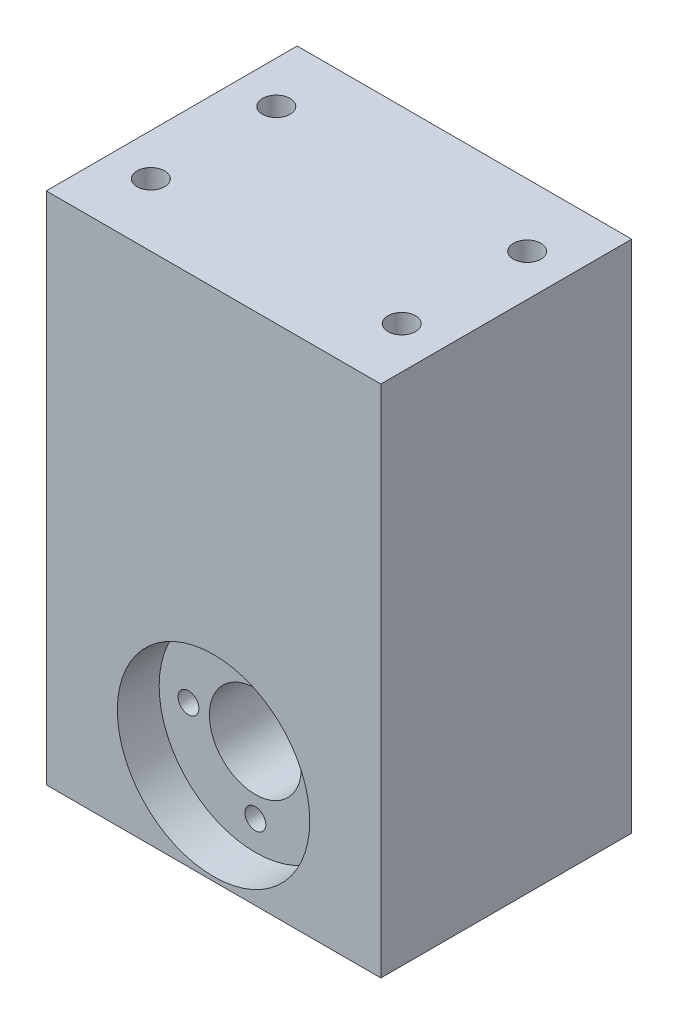
ISO-10303-21;
HEADER;
FILE_DESCRIPTION(('STEP AP214'),'2;1');
FILE_NAME('part.step','',(''),(''),'','','');
FILE_SCHEMA(('AUTOMOTIVE_DESIGN { 1 0 10303 214 1 1 1 1 }'));
ENDSEC;
DATA;
#1=APPLICATION_CONTEXT('core data for automotive mechanical design processes');
#2=APPLICATION_PROTOCOL_DEFINITION('international standard','automotive_design',2000,#1);
#3=PRODUCT_CONTEXT('',#1,'mechanical');
#4=PRODUCT('Part','Part','',(#3));
#5=PRODUCT_RELATED_PRODUCT_CATEGORY('part','',(#4));
#6=PRODUCT_DEFINITION_FORMATION('','',#4);
#7=PRODUCT_DEFINITION_CONTEXT('part definition',#1,'design');
#8=PRODUCT_DEFINITION('design','',#6,#7);
#9=PRODUCT_DEFINITION_SHAPE('','',#8);
#10=(LENGTH_UNIT() NAMED_UNIT(*) SI_UNIT(.MILLI.,.METRE.));
#11=(NAMED_UNIT(*) PLANE_ANGLE_UNIT() SI_UNIT($,.RADIAN.));
#12=(NAMED_UNIT(*) SI_UNIT($,.STERADIAN.) SOLID_ANGLE_UNIT());
#13=UNCERTAINTY_MEASURE_WITH_UNIT(LENGTH_MEASURE(1.E-05),#10,'distance_accuracy_value','');
#14=(GEOMETRIC_REPRESENTATION_CONTEXT(3) GLOBAL_UNCERTAINTY_ASSIGNED_CONTEXT((#13)) GLOBAL_UNIT_ASSIGNED_CONTEXT((#10,
#11,#12)) REPRESENTATION_CONTEXT('',''));
#15=CARTESIAN_POINT('',(0.,0.,0.));
#16=DIRECTION('',(0.,0.,1.));
#17=DIRECTION('',(1.,0.,0.));
#18=AXIS2_PLACEMENT_3D('',#15,#16,#17);
#19=CARTESIAN_POINT('',(20.,62.5,15.));
#20=DIRECTION('',(0.,-1.,0.));
#21=DIRECTION('',(0.,0.,-1.));
#22=AXIS2_PLACEMENT_3D('',#19,#20,#21);
#23=PLANE('',#22);
#24=CARTESIAN_POINT('',(-15.,62.5,-7.5));
#25=DIRECTION('',(0.,1.,0.));
#26=DIRECTION('',(0.,0.,1.));
#27=AXIS2_PLACEMENT_3D('',#24,#25,#26);
#28=CIRCLE('',#27,1.64999999999999);
#29=CARTESIAN_POINT('',(-15.,62.5,-5.85000000000001));
#30=VERTEX_POINT('',#29);
#31=EDGE_CURVE('E139',#30,#30,#28,.T.);
#32=ORIENTED_EDGE('',*,*,#31,.F.);
#33=EDGE_LOOP('',(#32));
#34=FACE_BOUND('',#33,.T.);
#35=CARTESIAN_POINT('',(15.,62.5,-7.5));
#36=DIRECTION('',(0.,1.,0.));
#37=DIRECTION('',(0.,0.,1.));
#38=AXIS2_PLACEMENT_3D('',#35,#36,#37);
#39=CIRCLE('',#38,1.64999999999999);
#40=CARTESIAN_POINT('',(15.,62.5,-5.85000000000001));
#41=VERTEX_POINT('',#40);
#42=EDGE_CURVE('E133',#41,#41,#39,.T.);
#43=ORIENTED_EDGE('',*,*,#42,.F.);
#44=EDGE_LOOP('',(#43));
#45=FACE_BOUND('',#44,.T.);
#46=CARTESIAN_POINT('',(15.,62.5,7.5));
#47=DIRECTION('',(0.,1.,0.));
#48=DIRECTION('',(0.,0.,1.));
#49=AXIS2_PLACEMENT_3D('',#46,#47,#48);
#50=CIRCLE('',#49,1.64999999999999);
#51=CARTESIAN_POINT('',(15.,62.5,9.14999999999998));
#52=VERTEX_POINT('',#51);
#53=EDGE_CURVE('E127',#52,#52,#50,.T.);
#54=ORIENTED_EDGE('',*,*,#53,.F.);
#55=EDGE_LOOP('',(#54));
#56=FACE_BOUND('',#55,.T.);
#57=CARTESIAN_POINT('',(-15.,62.5,7.50000000000001));
#58=DIRECTION('',(0.,1.,0.));
#59=DIRECTION('',(0.,0.,1.));
#60=AXIS2_PLACEMENT_3D('',#57,#58,#59);
#61=CIRCLE('',#60,1.64999999999999);
#62=CARTESIAN_POINT('',(-15.,62.5,9.15));
#63=VERTEX_POINT('',#62);
#64=EDGE_CURVE('E121',#63,#63,#61,.T.);
#65=ORIENTED_EDGE('',*,*,#64,.F.);
#66=EDGE_LOOP('',(#65));
#67=FACE_BOUND('',#66,.T.);
#68=DIRECTION('',(-1.,0.,0.));
#69=VECTOR('',#68,1.);
#70=CARTESIAN_POINT('',(20.,62.5,-15.));
#71=LINE('',#70,#69);
#72=CARTESIAN_POINT('',(20.,62.5,-15.));
#73=VERTEX_POINT('',#72);
#74=CARTESIAN_POINT('',(-20.,62.5,-15.));
#75=VERTEX_POINT('',#74);
#76=EDGE_CURVE('E95',#73,#75,#71,.T.);
#77=ORIENTED_EDGE('',*,*,#76,.T.);
#78=DIRECTION('',(0.,0.,-1.));
#79=VECTOR('',#78,1.);
#80=CARTESIAN_POINT('',(-20.,62.5,15.));
#81=LINE('',#80,#79);
#82=CARTESIAN_POINT('',(-20.,62.5,15.));
#83=VERTEX_POINT('',#82);
#84=EDGE_CURVE('E11',#83,#75,#81,.T.);
#85=ORIENTED_EDGE('',*,*,#84,.F.);
#86=DIRECTION('',(-1.,0.,0.));
#87=VECTOR('',#86,1.);
#88=CARTESIAN_POINT('',(20.,62.5,15.));
#89=LINE('',#88,#87);
#90=CARTESIAN_POINT('',(20.,62.5,15.));
#91=VERTEX_POINT('',#90);
#92=EDGE_CURVE('E89',#91,#83,#89,.T.);
#93=ORIENTED_EDGE('',*,*,#92,.F.);
#94=DIRECTION('',(0.,0.,-1.));
#95=VECTOR('',#94,1.);
#96=CARTESIAN_POINT('',(20.,62.5,15.));
#97=LINE('',#96,#95);
#98=EDGE_CURVE('E50',#91,#73,#97,.T.);
#99=ORIENTED_EDGE('',*,*,#98,.T.);
#100=EDGE_LOOP('',(#77,#85,#93,#99));
#101=FACE_BOUND('',#100,.T.);
#102=ADVANCED_FACE('F43',(#34,#45,#56,#67,#101),#23,.F.);
#103=CARTESIAN_POINT('',(-20.,62.5,15.));
#104=DIRECTION('',(1.,0.,0.));
#105=DIRECTION('',(0.,1.,0.));
#106=AXIS2_PLACEMENT_3D('',#103,#104,#105);
#107=PLANE('',#106);
#108=DIRECTION('',(0.,-1.,0.));
#109=VECTOR('',#108,1.);
#110=CARTESIAN_POINT('',(-20.,62.5,-15.));
#111=LINE('',#110,#109);
#112=CARTESIAN_POINT('',(-20.,1.,-15.));
#113=VERTEX_POINT('',#112);
#114=EDGE_CURVE('E90',#75,#113,#111,.T.);
#115=ORIENTED_EDGE('',*,*,#114,.T.);
#116=DIRECTION('',(0.,0.,1.));
#117=VECTOR('',#116,1.);
#118=CARTESIAN_POINT('',(-20.,1.,-15.));
#119=LINE('',#118,#117);
#120=CARTESIAN_POINT('',(-20.,1.,15.));
#121=VERTEX_POINT('',#120);
#122=EDGE_CURVE('E57',#113,#121,#119,.T.);
#123=ORIENTED_EDGE('',*,*,#122,.T.);
#124=DIRECTION('',(0.,-1.,0.));
#125=VECTOR('',#124,1.);
#126=CARTESIAN_POINT('',(-20.,62.5,15.));
#127=LINE('',#126,#125);
#128=EDGE_CURVE('E106',#83,#121,#127,.T.);
#129=ORIENTED_EDGE('',*,*,#128,.F.);
#130=ORIENTED_EDGE('',*,*,#84,.T.);
#131=EDGE_LOOP('',(#115,#123,#129,#130));
#132=FACE_BOUND('',#131,.T.);
#133=ADVANCED_FACE('F172',(#132),#107,.F.);
#134=CARTESIAN_POINT('',(20.,62.5,15.));
#135=DIRECTION('',(-1.,0.,0.));
#136=DIRECTION('',(0.,-1.,0.));
#137=AXIS2_PLACEMENT_3D('',#134,#135,#136);
#138=PLANE('',#137);
#139=DIRECTION('',(0.,1.,0.));
#140=VECTOR('',#139,1.);
#141=CARTESIAN_POINT('',(20.,62.5,15.));
#142=LINE('',#141,#140);
#143=CARTESIAN_POINT('',(20.,1.,15.));
#144=VERTEX_POINT('',#143);
#145=EDGE_CURVE('E66',#144,#91,#142,.T.);
#146=ORIENTED_EDGE('',*,*,#145,.F.);
#147=DIRECTION('',(0.,0.,1.));
#148=VECTOR('',#147,1.);
#149=CARTESIAN_POINT('',(20.,1.,-15.));
#150=LINE('',#149,#148);
#151=CARTESIAN_POINT('',(20.,1.,-15.));
#152=VERTEX_POINT('',#151);
#153=EDGE_CURVE('E86',#152,#144,#150,.T.);
#154=ORIENTED_EDGE('',*,*,#153,.F.);
#155=DIRECTION('',(0.,1.,0.));
#156=VECTOR('',#155,1.);
#157=CARTESIAN_POINT('',(20.,62.5,-15.));
#158=LINE('',#157,#156);
#159=EDGE_CURVE('E80',#152,#73,#158,.T.);
#160=ORIENTED_EDGE('',*,*,#159,.T.);
#161=ORIENTED_EDGE('',*,*,#98,.F.);
#162=EDGE_LOOP('',(#146,#154,#160,#161));
#163=FACE_BOUND('',#162,.T.);
#164=ADVANCED_FACE('F82',(#163),#138,.F.);
#165=CARTESIAN_POINT('',(0.,0.,15.));
#166=DIRECTION('',(0.,0.,1.));
#167=DIRECTION('',(1.,0.,0.));
#168=AXIS2_PLACEMENT_3D('',#165,#166,#167);
#169=PLANE('',#168);
#170=DIRECTION('',(-1.,0.,0.));
#171=VECTOR('',#170,1.);
#172=CARTESIAN_POINT('',(-20.,1.,15.));
#173=LINE('',#172,#171);
#174=EDGE_CURVE('E169',#144,#121,#173,.T.);
#175=ORIENTED_EDGE('',*,*,#174,.F.);
#176=ORIENTED_EDGE('',*,*,#145,.T.);
#177=ORIENTED_EDGE('',*,*,#92,.T.);
#178=ORIENTED_EDGE('',*,*,#128,.T.);
#179=EDGE_LOOP('',(#175,#176,#177,#178));
#180=FACE_BOUND('',#179,.T.);
#181=CARTESIAN_POINT('',(0.,13.,15.));
#182=DIRECTION('',(0.,0.,1.));
#183=DIRECTION('',(1.,0.,0.));
#184=AXIS2_PLACEMENT_3D('',#181,#182,#183);
#185=CIRCLE('',#184,11.5);
#186=CARTESIAN_POINT('',(11.5,13.,15.));
#187=VERTEX_POINT('',#186);
#188=EDGE_CURVE('E102',#187,#187,#185,.T.);
#189=ORIENTED_EDGE('',*,*,#188,.F.);
#190=EDGE_LOOP('',(#189));
#191=FACE_BOUND('',#190,.T.);
#192=ADVANCED_FACE('F174',(#180,#191),#169,.T.);
#193=CARTESIAN_POINT('',(0.,0.,-15.));
#194=DIRECTION('',(0.,0.,1.));
#195=DIRECTION('',(1.,0.,0.));
#196=AXIS2_PLACEMENT_3D('',#193,#194,#195);
#197=PLANE('',#196);
#198=CARTESIAN_POINT('',(0.,21.,-15.));
#199=DIRECTION('',(0.,0.,1.));
#200=DIRECTION('',(1.,0.,0.));
#201=AXIS2_PLACEMENT_3D('',#198,#199,#200);
#202=CIRCLE('',#201,1.25);
#203=CARTESIAN_POINT('',(1.24999999999999,21.,-15.));
#204=VERTEX_POINT('',#203);
#205=EDGE_CURVE('E160',#204,#204,#202,.T.);
#206=ORIENTED_EDGE('',*,*,#205,.T.);
#207=EDGE_LOOP('',(#206));
#208=FACE_BOUND('',#207,.T.);
#209=CARTESIAN_POINT('',(0.,5.,-15.));
#210=DIRECTION('',(0.,0.,1.));
#211=DIRECTION('',(1.,0.,0.));
#212=AXIS2_PLACEMENT_3D('',#209,#210,#211);
#213=CIRCLE('',#212,1.25);
#214=CARTESIAN_POINT('',(1.25,5.,-15.));
#215=VERTEX_POINT('',#214);
#216=EDGE_CURVE('E154',#215,#215,#213,.T.);
#217=ORIENTED_EDGE('',*,*,#216,.T.);
#218=EDGE_LOOP('',(#217));
#219=FACE_BOUND('',#218,.T.);
#220=CARTESIAN_POINT('',(-8.,13.,-15.));
#221=DIRECTION('',(0.,0.,1.));
#222=DIRECTION('',(1.,0.,0.));
#223=AXIS2_PLACEMENT_3D('',#220,#221,#222);
#224=CIRCLE('',#223,1.25);
#225=CARTESIAN_POINT('',(-6.75000000000001,13.,-15.));
#226=VERTEX_POINT('',#225);
#227=EDGE_CURVE('E148',#226,#226,#224,.T.);
#228=ORIENTED_EDGE('',*,*,#227,.T.);
#229=EDGE_LOOP('',(#228));
#230=FACE_BOUND('',#229,.T.);
#231=CARTESIAN_POINT('',(8.,13.,-15.));
#232=DIRECTION('',(0.,0.,1.));
#233=DIRECTION('',(1.,0.,0.));
#234=AXIS2_PLACEMENT_3D('',#231,#232,#233);
#235=CIRCLE('',#234,1.24999999999999);
#236=CARTESIAN_POINT('',(9.24999999999999,13.,-15.));
#237=VERTEX_POINT('',#236);
#238=EDGE_CURVE('E142',#237,#237,#235,.T.);
#239=ORIENTED_EDGE('',*,*,#238,.T.);
#240=EDGE_LOOP('',(#239));
#241=FACE_BOUND('',#240,.T.);
#242=CARTESIAN_POINT('',(0.,13.,-15.));
#243=DIRECTION('',(0.,0.,1.));
#244=DIRECTION('',(1.,0.,0.));
#245=AXIS2_PLACEMENT_3D('',#242,#243,#244);
#246=CIRCLE('',#245,5.5);
#247=CARTESIAN_POINT('',(5.5,13.,-15.));
#248=VERTEX_POINT('',#247);
#249=EDGE_CURVE('E111',#248,#248,#246,.T.);
#250=ORIENTED_EDGE('',*,*,#249,.T.);
#251=EDGE_LOOP('',(#250));
#252=FACE_BOUND('',#251,.T.);
#253=ORIENTED_EDGE('',*,*,#159,.F.);
#254=DIRECTION('',(-1.,0.,0.));
#255=VECTOR('',#254,1.);
#256=CARTESIAN_POINT('',(-20.,1.,-15.));
#257=LINE('',#256,#255);
#258=EDGE_CURVE('E167',#152,#113,#257,.T.);
#259=ORIENTED_EDGE('',*,*,#258,.T.);
#260=ORIENTED_EDGE('',*,*,#114,.F.);
#261=ORIENTED_EDGE('',*,*,#76,.F.);
#262=EDGE_LOOP('',(#253,#259,#260,#261));
#263=FACE_BOUND('',#262,.T.);
#264=ADVANCED_FACE('F96',(#208,#219,#230,#241,#252,#263),#197,.F.);
#265=CARTESIAN_POINT('',(0.,13.,10.));
#266=DIRECTION('',(0.,0.,1.));
#267=DIRECTION('',(1.,0.,0.));
#268=AXIS2_PLACEMENT_3D('',#265,#266,#267);
#269=CYLINDRICAL_SURFACE('',#268,11.5);
#270=CARTESIAN_POINT('',(0.,13.,10.));
#271=DIRECTION('',(0.,0.,1.));
#272=DIRECTION('',(1.,0.,0.));
#273=AXIS2_PLACEMENT_3D('',#270,#271,#272);
#274=CIRCLE('',#273,11.5);
#275=CARTESIAN_POINT('',(11.5,13.,10.));
#276=VERTEX_POINT('',#275);
#277=EDGE_CURVE('E98',#276,#276,#274,.T.);
#278=ORIENTED_EDGE('',*,*,#277,.F.);
#279=EDGE_LOOP('',(#278));
#280=FACE_BOUND('',#279,.T.);
#281=ORIENTED_EDGE('',*,*,#188,.T.);
#282=EDGE_LOOP('',(#281));
#283=FACE_BOUND('',#282,.T.);
#284=ADVANCED_FACE('F181',(#280,#283),#269,.F.);
#285=CARTESIAN_POINT('',(0.,13.,10.));
#286=DIRECTION('',(0.,0.,1.));
#287=DIRECTION('',(1.,0.,0.));
#288=AXIS2_PLACEMENT_3D('',#285,#286,#287);
#289=PLANE('',#288);
#290=CARTESIAN_POINT('',(0.,21.,10.));
#291=DIRECTION('',(0.,0.,1.));
#292=DIRECTION('',(1.,0.,0.));
#293=AXIS2_PLACEMENT_3D('',#290,#291,#292);
#294=CIRCLE('',#293,1.25);
#295=CARTESIAN_POINT('',(1.25,21.,10.));
#296=VERTEX_POINT('',#295);
#297=EDGE_CURVE('E163',#296,#296,#294,.T.);
#298=ORIENTED_EDGE('',*,*,#297,.F.);
#299=EDGE_LOOP('',(#298));
#300=FACE_BOUND('',#299,.T.);
#301=CARTESIAN_POINT('',(0.,5.,10.));
#302=DIRECTION('',(0.,0.,1.));
#303=DIRECTION('',(1.,0.,0.));
#304=AXIS2_PLACEMENT_3D('',#301,#302,#303);
#305=CIRCLE('',#304,1.25);
#306=CARTESIAN_POINT('',(1.25,5.,10.));
#307=VERTEX_POINT('',#306);
#308=EDGE_CURVE('E157',#307,#307,#305,.T.);
#309=ORIENTED_EDGE('',*,*,#308,.F.);
#310=EDGE_LOOP('',(#309));
#311=FACE_BOUND('',#310,.T.);
#312=CARTESIAN_POINT('',(-8.,13.,10.));
#313=DIRECTION('',(0.,0.,1.));
#314=DIRECTION('',(1.,0.,0.));
#315=AXIS2_PLACEMENT_3D('',#312,#313,#314);
#316=CIRCLE('',#315,1.25);
#317=CARTESIAN_POINT('',(-6.75,13.,10.));
#318=VERTEX_POINT('',#317);
#319=EDGE_CURVE('E151',#318,#318,#316,.T.);
#320=ORIENTED_EDGE('',*,*,#319,.F.);
#321=EDGE_LOOP('',(#320));
#322=FACE_BOUND('',#321,.T.);
#323=CARTESIAN_POINT('',(8.,13.,10.));
#324=DIRECTION('',(0.,0.,1.));
#325=DIRECTION('',(1.,0.,0.));
#326=AXIS2_PLACEMENT_3D('',#323,#324,#325);
#327=CIRCLE('',#326,1.25);
#328=CARTESIAN_POINT('',(9.25,13.,10.));
#329=VERTEX_POINT('',#328);
#330=EDGE_CURVE('E145',#329,#329,#327,.T.);
#331=ORIENTED_EDGE('',*,*,#330,.F.);
#332=EDGE_LOOP('',(#331));
#333=FACE_BOUND('',#332,.T.);
#334=CARTESIAN_POINT('',(0.,13.,10.));
#335=DIRECTION('',(0.,0.,1.));
#336=DIRECTION('',(1.,0.,0.));
#337=AXIS2_PLACEMENT_3D('',#334,#335,#336);
#338=CIRCLE('',#337,5.5);
#339=CARTESIAN_POINT('',(5.5,13.,10.));
#340=VERTEX_POINT('',#339);
#341=EDGE_CURVE('E113',#340,#340,#338,.T.);
#342=ORIENTED_EDGE('',*,*,#341,.F.);
#343=EDGE_LOOP('',(#342));
#344=FACE_BOUND('',#343,.T.);
#345=ORIENTED_EDGE('',*,*,#277,.T.);
#346=EDGE_LOOP('',(#345));
#347=FACE_BOUND('',#346,.T.);
#348=ADVANCED_FACE('F183',(#300,#311,#322,#333,#344,#347),#289,.T.);
#349=CARTESIAN_POINT('',(0.,13.,-15.));
#350=DIRECTION('',(0.,0.,1.));
#351=DIRECTION('',(1.,0.,0.));
#352=AXIS2_PLACEMENT_3D('',#349,#350,#351);
#353=CYLINDRICAL_SURFACE('',#352,5.5);
#354=CARTESIAN_POINT('',(5.5,13.,-15.));
#355=CARTESIAN_POINT('',(5.5,13.,-14.7395833333333));
#356=CARTESIAN_POINT('',(5.5,13.,-14.4791666666667));
#357=CARTESIAN_POINT('',(5.5,13.,-13.9583333333333));
#358=CARTESIAN_POINT('',(5.5,13.,-13.6979166666667));
#359=CARTESIAN_POINT('',(5.5,13.,-13.1770833333333));
#360=CARTESIAN_POINT('',(5.5,13.,-12.9166666666667));
#361=CARTESIAN_POINT('',(5.5,13.,-12.3958333333333));
#362=CARTESIAN_POINT('',(5.5,13.,-12.1354166666667));
#363=CARTESIAN_POINT('',(5.5,13.,-11.6145833333333));
#364=CARTESIAN_POINT('',(5.5,13.,-11.3541666666667));
#365=CARTESIAN_POINT('',(5.5,13.,-10.8333333333333));
#366=CARTESIAN_POINT('',(5.5,13.,-10.5729166666667));
#367=CARTESIAN_POINT('',(5.5,13.,-10.0520833333333));
#368=CARTESIAN_POINT('',(5.5,13.,-9.79166666666667));
#369=CARTESIAN_POINT('',(5.5,13.,-9.27083333333333));
#370=CARTESIAN_POINT('',(5.5,13.,-9.01041666666667));
#371=CARTESIAN_POINT('',(5.5,13.,-8.48958333333333));
#372=CARTESIAN_POINT('',(5.5,13.,-8.22916666666667));
#373=CARTESIAN_POINT('',(5.5,13.,-7.70833333333333));
#374=CARTESIAN_POINT('',(5.5,13.,-7.44791666666667));
#375=CARTESIAN_POINT('',(5.5,13.,-6.92708333333333));
#376=CARTESIAN_POINT('',(5.5,13.,-6.66666666666667));
#377=CARTESIAN_POINT('',(5.5,13.,-6.14583333333334));
#378=CARTESIAN_POINT('',(5.5,13.,-5.88541666666667));
#379=CARTESIAN_POINT('',(5.5,13.,-5.36458333333333));
#380=CARTESIAN_POINT('',(5.5,13.,-5.10416666666667));
#381=CARTESIAN_POINT('',(5.5,13.,-4.58333333333334));
#382=CARTESIAN_POINT('',(5.5,13.,-4.32291666666667));
#383=CARTESIAN_POINT('',(5.5,13.,-3.80208333333334));
#384=CARTESIAN_POINT('',(5.5,13.,-3.54166666666667));
#385=CARTESIAN_POINT('',(5.5,13.,-3.02083333333334));
#386=CARTESIAN_POINT('',(5.5,13.,-2.76041666666667));
#387=CARTESIAN_POINT('',(5.5,13.,-2.23958333333334));
#388=CARTESIAN_POINT('',(5.5,13.,-1.97916666666667));
#389=CARTESIAN_POINT('',(5.5,13.,-1.45833333333334));
#390=CARTESIAN_POINT('',(5.5,13.,-1.19791666666667));
#391=CARTESIAN_POINT('',(5.5,13.,-0.677083333333336));
#392=CARTESIAN_POINT('',(5.5,13.,-0.416666666666669));
#393=CARTESIAN_POINT('',(5.5,13.,0.104166666666664));
#394=CARTESIAN_POINT('',(5.5,13.,0.364583333333331));
#395=CARTESIAN_POINT('',(5.5,13.,0.885416666666664));
#396=CARTESIAN_POINT('',(5.5,13.,1.14583333333333));
#397=CARTESIAN_POINT('',(5.5,13.,1.66666666666666));
#398=CARTESIAN_POINT('',(5.5,13.,1.92708333333333));
#399=CARTESIAN_POINT('',(5.5,13.,2.44791666666667));
#400=CARTESIAN_POINT('',(5.5,13.,2.70833333333333));
#401=CARTESIAN_POINT('',(5.5,13.,3.22916666666667));
#402=CARTESIAN_POINT('',(5.5,13.,3.48958333333333));
#403=CARTESIAN_POINT('',(5.5,13.,4.01041666666667));
#404=CARTESIAN_POINT('',(5.5,13.,4.27083333333333));
#405=CARTESIAN_POINT('',(5.5,13.,4.79166666666666));
#406=CARTESIAN_POINT('',(5.5,13.,5.05208333333333));
#407=CARTESIAN_POINT('',(5.5,13.,5.57291666666666));
#408=CARTESIAN_POINT('',(5.5,13.,5.83333333333333));
#409=CARTESIAN_POINT('',(5.5,13.,6.35416666666667));
#410=CARTESIAN_POINT('',(5.5,13.,6.61458333333333));
#411=CARTESIAN_POINT('',(5.5,13.,7.13541666666667));
#412=CARTESIAN_POINT('',(5.5,13.,7.39583333333333));
#413=CARTESIAN_POINT('',(5.5,13.,7.91666666666667));
#414=CARTESIAN_POINT('',(5.5,13.,8.17708333333333));
#415=CARTESIAN_POINT('',(5.5,13.,8.69791666666666));
#416=CARTESIAN_POINT('',(5.5,13.,8.95833333333333));
#417=CARTESIAN_POINT('',(5.5,13.,9.47916666666667));
#418=CARTESIAN_POINT('',(5.5,13.,9.73958333333333));
#419=CARTESIAN_POINT('',(5.5,13.,10.));
#420=B_SPLINE_CURVE_WITH_KNOTS('',3,(#354,#355,#356,#357,#358,#359,#360,#361,#362,#363,#364,
#365,#366,#367,#368,#369,#370,#371,#372,#373,#374,#375,#376,#377,#378,#379,#380,#381,#382,#383,
#384,#385,#386,#387,#388,#389,#390,#391,#392,#393,#394,#395,#396,#397,#398,#399,#400,#401,#402,
#403,#404,#405,#406,#407,#408,#409,#410,#411,#412,#413,#414,#415,#416,#417,#418,#419),
.UNSPECIFIED.,.F.,.F.,(4,2,2,2,2,2,2,2,2,2,2,2,2,2,2,2,2,2,2,2,2,2,2,2,2,2,2,2,2,2,2,2,4),(0.,
0.781250000000001,1.5625,2.34375,3.125,3.90625,4.6875,5.46875,6.25,7.03125,7.8125,8.59375,9.375,
10.15625,10.9375,11.71875,12.5,13.28125,14.0625,14.84375,15.625,16.40625,17.1875,17.96875,18.75,
19.53125,20.3125,21.09375,21.875,22.65625,23.4375,24.21875,25.),.UNSPECIFIED.);
#421=EDGE_CURVE('BSEAM190',#248,#340,#420,.T.);
#422=ORIENTED_EDGE('',*,*,#249,.F.);
#423=ORIENTED_EDGE('',*,*,#341,.T.);
#424=ORIENTED_EDGE('',*,*,#421,.T.);
#425=ORIENTED_EDGE('',*,*,#421,.F.);
#426=EDGE_LOOP('',(#422,#424,#423,#425));
#427=FACE_BOUND('',#426,.T.);
#428=ADVANCED_FACE('F190',(#427),#353,.F.);
#429=CARTESIAN_POINT('',(-15.,51.,7.50000000000001));
#430=DIRECTION('',(0.,1.,0.));
#431=DIRECTION('',(0.,0.,1.));
#432=AXIS2_PLACEMENT_3D('',#429,#430,#431);
#433=CONICAL_SURFACE('',#432,1.65,1.02974425867665);
#434=CARTESIAN_POINT('',(-15.,50.0085799786045,7.50000000000001));
#435=VERTEX_POINT('',#434);
#436=VERTEX_LOOP('',#435);
#437=FACE_BOUND('',#436,.T.);
#438=CARTESIAN_POINT('',(-15.,51.,7.50000000000001));
#439=DIRECTION('',(0.,1.,0.));
#440=DIRECTION('',(0.,0.,1.));
#441=AXIS2_PLACEMENT_3D('',#438,#439,#440);
#442=CIRCLE('',#441,1.65);
#443=CARTESIAN_POINT('',(-15.,51.,9.15));
#444=VERTEX_POINT('',#443);
#445=EDGE_CURVE('E116',#444,#444,#442,.T.);
#446=ORIENTED_EDGE('',*,*,#445,.T.);
#447=EDGE_LOOP('',(#446));
#448=FACE_BOUND('',#447,.T.);
#449=ADVANCED_FACE('F212',(#437,#448),#433,.F.);
#450=CARTESIAN_POINT('',(-15.,62.5,7.50000000000001));
#451=DIRECTION('',(0.,1.,0.));
#452=DIRECTION('',(0.,0.,1.));
#453=AXIS2_PLACEMENT_3D('',#450,#451,#452);
#454=CYLINDRICAL_SURFACE('',#453,1.64999999999999);
#455=ORIENTED_EDGE('',*,*,#445,.F.);
#456=EDGE_LOOP('',(#455));
#457=FACE_BOUND('',#456,.T.);
#458=ORIENTED_EDGE('',*,*,#64,.T.);
#459=EDGE_LOOP('',(#458));
#460=FACE_BOUND('',#459,.T.);
#461=ADVANCED_FACE('F209',(#457,#460),#454,.F.);
#462=CARTESIAN_POINT('',(15.,51.,7.5));
#463=DIRECTION('',(0.,1.,0.));
#464=DIRECTION('',(0.,0.,1.));
#465=AXIS2_PLACEMENT_3D('',#462,#463,#464);
#466=CONICAL_SURFACE('',#465,1.65,1.02974425867665);
#467=CARTESIAN_POINT('',(15.,50.0085799786045,7.5));
#468=VERTEX_POINT('',#467);
#469=VERTEX_LOOP('',#468);
#470=FACE_BOUND('',#469,.T.);
#471=CARTESIAN_POINT('',(15.,51.,7.5));
#472=DIRECTION('',(0.,1.,0.));
#473=DIRECTION('',(0.,0.,1.));
#474=AXIS2_PLACEMENT_3D('',#471,#472,#473);
#475=CIRCLE('',#474,1.65);
#476=CARTESIAN_POINT('',(15.,51.,9.15));
#477=VERTEX_POINT('',#476);
#478=EDGE_CURVE('E124',#477,#477,#475,.T.);
#479=ORIENTED_EDGE('',*,*,#478,.T.);
#480=EDGE_LOOP('',(#479));
#481=FACE_BOUND('',#480,.T.);
#482=ADVANCED_FACE('F211',(#470,#481),#466,.F.);
#483=CARTESIAN_POINT('',(15.,62.5,7.5));
#484=DIRECTION('',(0.,1.,0.));
#485=DIRECTION('',(0.,0.,1.));
#486=AXIS2_PLACEMENT_3D('',#483,#484,#485);
#487=CYLINDRICAL_SURFACE('',#486,1.64999999999999);
#488=ORIENTED_EDGE('',*,*,#478,.F.);
#489=EDGE_LOOP('',(#488));
#490=FACE_BOUND('',#489,.T.);
#491=ORIENTED_EDGE('',*,*,#53,.T.);
#492=EDGE_LOOP('',(#491));
#493=FACE_BOUND('',#492,.T.);
#494=ADVANCED_FACE('F219',(#490,#493),#487,.F.);
#495=CARTESIAN_POINT('',(15.,51.,-7.5));
#496=DIRECTION('',(0.,1.,0.));
#497=DIRECTION('',(0.,0.,1.));
#498=AXIS2_PLACEMENT_3D('',#495,#496,#497);
#499=CONICAL_SURFACE('',#498,1.65,1.02974425867665);
#500=CARTESIAN_POINT('',(15.,50.0085799786045,-7.5));
#501=VERTEX_POINT('',#500);
#502=VERTEX_LOOP('',#501);
#503=FACE_BOUND('',#502,.T.);
#504=CARTESIAN_POINT('',(15.,51.,-7.5));
#505=DIRECTION('',(0.,1.,0.));
#506=DIRECTION('',(0.,0.,1.));
#507=AXIS2_PLACEMENT_3D('',#504,#505,#506);
#508=CIRCLE('',#507,1.65);
#509=CARTESIAN_POINT('',(15.,51.,-5.85));
#510=VERTEX_POINT('',#509);
#511=EDGE_CURVE('E130',#510,#510,#508,.T.);
#512=ORIENTED_EDGE('',*,*,#511,.T.);
#513=EDGE_LOOP('',(#512));
#514=FACE_BOUND('',#513,.T.);
#515=ADVANCED_FACE('F275',(#503,#514),#499,.F.);
#516=CARTESIAN_POINT('',(15.,62.5,-7.5));
#517=DIRECTION('',(0.,1.,0.));
#518=DIRECTION('',(0.,0.,1.));
#519=AXIS2_PLACEMENT_3D('',#516,#517,#518);
#520=CYLINDRICAL_SURFACE('',#519,1.65);
#521=ORIENTED_EDGE('',*,*,#511,.F.);
#522=EDGE_LOOP('',(#521));
#523=FACE_BOUND('',#522,.T.);
#524=ORIENTED_EDGE('',*,*,#42,.T.);
#525=EDGE_LOOP('',(#524));
#526=FACE_BOUND('',#525,.T.);
#527=ADVANCED_FACE('F287',(#523,#526),#520,.F.);
#528=CARTESIAN_POINT('',(-15.,51.,-7.5));
#529=DIRECTION('',(0.,1.,0.));
#530=DIRECTION('',(0.,0.,1.));
#531=AXIS2_PLACEMENT_3D('',#528,#529,#530);
#532=CONICAL_SURFACE('',#531,1.65,1.02974425867665);
#533=CARTESIAN_POINT('',(-15.,50.0085799786045,-7.5));
#534=VERTEX_POINT('',#533);
#535=VERTEX_LOOP('',#534);
#536=FACE_BOUND('',#535,.T.);
#537=CARTESIAN_POINT('',(-15.,51.,-7.5));
#538=DIRECTION('',(0.,1.,0.));
#539=DIRECTION('',(0.,0.,1.));
#540=AXIS2_PLACEMENT_3D('',#537,#538,#539);
#541=CIRCLE('',#540,1.65);
#542=CARTESIAN_POINT('',(-15.,51.,-5.85));
#543=VERTEX_POINT('',#542);
#544=EDGE_CURVE('E136',#543,#543,#541,.T.);
#545=ORIENTED_EDGE('',*,*,#544,.T.);
#546=EDGE_LOOP('',(#545));
#547=FACE_BOUND('',#546,.T.);
#548=ADVANCED_FACE('F298',(#536,#547),#532,.F.);
#549=CARTESIAN_POINT('',(-15.,62.5,-7.5));
#550=DIRECTION('',(0.,1.,0.));
#551=DIRECTION('',(0.,0.,1.));
#552=AXIS2_PLACEMENT_3D('',#549,#550,#551);
#553=CYLINDRICAL_SURFACE('',#552,1.64999999999999);
#554=ORIENTED_EDGE('',*,*,#544,.F.);
#555=EDGE_LOOP('',(#554));
#556=FACE_BOUND('',#555,.T.);
#557=ORIENTED_EDGE('',*,*,#31,.T.);
#558=EDGE_LOOP('',(#557));
#559=FACE_BOUND('',#558,.T.);
#560=ADVANCED_FACE('F311',(#556,#559),#553,.F.);
#561=CARTESIAN_POINT('',(8.,13.,10.));
#562=DIRECTION('',(0.,0.,1.));
#563=DIRECTION('',(1.,0.,0.));
#564=AXIS2_PLACEMENT_3D('',#561,#562,#563);
#565=CYLINDRICAL_SURFACE('',#564,1.25);
#566=ORIENTED_EDGE('',*,*,#238,.F.);
#567=EDGE_LOOP('',(#566));
#568=FACE_BOUND('',#567,.T.);
#569=ORIENTED_EDGE('',*,*,#330,.T.);
#570=EDGE_LOOP('',(#569));
#571=FACE_BOUND('',#570,.T.);
#572=ADVANCED_FACE('F322',(#568,#571),#565,.F.);
#573=CARTESIAN_POINT('',(-8.,13.,10.));
#574=DIRECTION('',(0.,0.,1.));
#575=DIRECTION('',(1.,0.,0.));
#576=AXIS2_PLACEMENT_3D('',#573,#574,#575);
#577=CYLINDRICAL_SURFACE('',#576,1.25);
#578=ORIENTED_EDGE('',*,*,#227,.F.);
#579=EDGE_LOOP('',(#578));
#580=FACE_BOUND('',#579,.T.);
#581=ORIENTED_EDGE('',*,*,#319,.T.);
#582=EDGE_LOOP('',(#581));
#583=FACE_BOUND('',#582,.T.);
#584=ADVANCED_FACE('F347',(#580,#583),#577,.F.);
#585=CARTESIAN_POINT('',(0.,5.,10.));
#586=DIRECTION('',(0.,0.,1.));
#587=DIRECTION('',(1.,0.,0.));
#588=AXIS2_PLACEMENT_3D('',#585,#586,#587);
#589=CYLINDRICAL_SURFACE('',#588,1.25);
#590=ORIENTED_EDGE('',*,*,#216,.F.);
#591=EDGE_LOOP('',(#590));
#592=FACE_BOUND('',#591,.T.);
#593=ORIENTED_EDGE('',*,*,#308,.T.);
#594=EDGE_LOOP('',(#593));
#595=FACE_BOUND('',#594,.T.);
#596=ADVANCED_FACE('F359',(#592,#595),#589,.F.);
#597=CARTESIAN_POINT('',(0.,21.,10.));
#598=DIRECTION('',(0.,0.,1.));
#599=DIRECTION('',(1.,0.,0.));
#600=AXIS2_PLACEMENT_3D('',#597,#598,#599);
#601=CYLINDRICAL_SURFACE('',#600,1.25);
#602=ORIENTED_EDGE('',*,*,#205,.F.);
#603=EDGE_LOOP('',(#602));
#604=FACE_BOUND('',#603,.T.);
#605=ORIENTED_EDGE('',*,*,#297,.T.);
#606=EDGE_LOOP('',(#605));
#607=FACE_BOUND('',#606,.T.);
#608=ADVANCED_FACE('F371',(#604,#607),#601,.F.);
#609=CARTESIAN_POINT('',(-20.,1.,-15.));
#610=DIRECTION('',(0.,1.,0.));
#611=DIRECTION('',(0.,0.,1.));
#612=AXIS2_PLACEMENT_3D('',#609,#610,#611);
#613=PLANE('',#612);
#614=ORIENTED_EDGE('',*,*,#174,.T.);
#615=ORIENTED_EDGE('',*,*,#122,.F.);
#616=ORIENTED_EDGE('',*,*,#258,.F.);
#617=ORIENTED_EDGE('',*,*,#153,.T.);
#618=EDGE_LOOP('',(#614,#615,#616,#617));
#619=FACE_BOUND('',#618,.T.);
#620=ADVANCED_FACE('F384',(#619),#613,.F.);
#621=CLOSED_SHELL('',(#102,#133,#164,#192,#264,#284,#348,#428,#449,#461,#482,#494,#515,#527,
#548,#560,#572,#584,#596,#608,#620));
#622=MANIFOLD_SOLID_BREP('B2',#621);
#623=ADVANCED_BREP_SHAPE_REPRESENTATION('',(#18,#622),#14);
#624=SHAPE_DEFINITION_REPRESENTATION(#9,#623);
ENDSEC;
END-ISO-10303-21;
